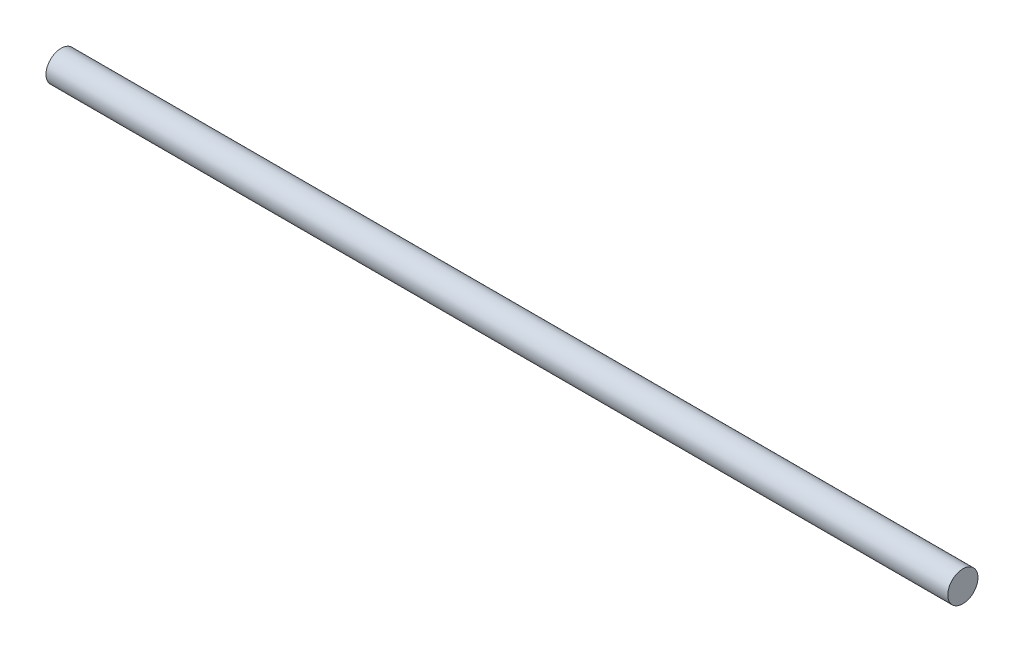
ISO-10303-21;
HEADER;
FILE_DESCRIPTION(('STEP AP214'),'2;1');
FILE_NAME('part.step','',(''),(''),'','','');
FILE_SCHEMA(('AUTOMOTIVE_DESIGN { 1 0 10303 214 1 1 1 1 }'));
ENDSEC;
DATA;
#1=APPLICATION_CONTEXT('core data for automotive mechanical design processes');
#2=APPLICATION_PROTOCOL_DEFINITION('international standard','automotive_design',2000,#1);
#3=PRODUCT_CONTEXT('',#1,'mechanical');
#4=PRODUCT('Part','Part','',(#3));
#5=PRODUCT_RELATED_PRODUCT_CATEGORY('part','',(#4));
#6=PRODUCT_DEFINITION_FORMATION('','',#4);
#7=PRODUCT_DEFINITION_CONTEXT('part definition',#1,'design');
#8=PRODUCT_DEFINITION('design','',#6,#7);
#9=PRODUCT_DEFINITION_SHAPE('','',#8);
#10=(LENGTH_UNIT() NAMED_UNIT(*) SI_UNIT(.MILLI.,.METRE.));
#11=(NAMED_UNIT(*) PLANE_ANGLE_UNIT() SI_UNIT($,.RADIAN.));
#12=(NAMED_UNIT(*) SI_UNIT($,.STERADIAN.) SOLID_ANGLE_UNIT());
#13=UNCERTAINTY_MEASURE_WITH_UNIT(LENGTH_MEASURE(1.E-05),#10,'distance_accuracy_value','');
#14=(GEOMETRIC_REPRESENTATION_CONTEXT(3) GLOBAL_UNCERTAINTY_ASSIGNED_CONTEXT((#13)) GLOBAL_UNIT_ASSIGNED_CONTEXT((#10,
#11,#12)) REPRESENTATION_CONTEXT('',''));
#15=CARTESIAN_POINT('',(0.,0.,0.));
#16=DIRECTION('',(0.,0.,1.));
#17=DIRECTION('',(1.,0.,0.));
#18=AXIS2_PLACEMENT_3D('',#15,#16,#17);
#19=CARTESIAN_POINT('',(70.,0.,0.));
#20=DIRECTION('',(-1.,0.,0.));
#21=DIRECTION('',(0.,0.,1.));
#22=AXIS2_PLACEMENT_3D('',#19,#20,#21);
#23=CYLINDRICAL_SURFACE('',#22,2.35);
#24=CARTESIAN_POINT('',(70.,0.,0.));
#25=DIRECTION('',(1.,0.,0.));
#26=DIRECTION('',(0.,0.,-1.));
#27=AXIS2_PLACEMENT_3D('',#24,#25,#26);
#28=CIRCLE('',#27,2.35);
#29=CARTESIAN_POINT('',(70.,0.,-2.35));
#30=VERTEX_POINT('',#29);
#31=EDGE_CURVE('E10',#30,#30,#28,.T.);
#32=ORIENTED_EDGE('',*,*,#31,.F.);
#33=EDGE_LOOP('',(#32));
#34=FACE_BOUND('',#33,.T.);
#35=CARTESIAN_POINT('',(-70.,0.,0.));
#36=DIRECTION('',(1.,0.,0.));
#37=DIRECTION('',(0.,0.,-1.));
#38=AXIS2_PLACEMENT_3D('',#35,#36,#37);
#39=CIRCLE('',#38,2.35);
#40=CARTESIAN_POINT('',(-70.,0.,-2.35));
#41=VERTEX_POINT('',#40);
#42=EDGE_CURVE('E40',#41,#41,#39,.T.);
#43=ORIENTED_EDGE('',*,*,#42,.T.);
#44=EDGE_LOOP('',(#43));
#45=FACE_BOUND('',#44,.T.);
#46=ADVANCED_FACE('F37',(#34,#45),#23,.T.);
#47=CARTESIAN_POINT('',(70.,0.,0.));
#48=DIRECTION('',(1.,0.,0.));
#49=DIRECTION('',(0.,0.,-1.));
#50=AXIS2_PLACEMENT_3D('',#47,#48,#49);
#51=PLANE('',#50);
#52=ORIENTED_EDGE('',*,*,#31,.T.);
#53=EDGE_LOOP('',(#52));
#54=FACE_BOUND('',#53,.T.);
#55=ADVANCED_FACE('F52',(#54),#51,.T.);
#56=CARTESIAN_POINT('',(-70.,0.,0.));
#57=DIRECTION('',(1.,0.,0.));
#58=DIRECTION('',(0.,0.,-1.));
#59=AXIS2_PLACEMENT_3D('',#56,#57,#58);
#60=PLANE('',#59);
#61=ORIENTED_EDGE('',*,*,#42,.F.);
#62=EDGE_LOOP('',(#61));
#63=FACE_BOUND('',#62,.T.);
#64=ADVANCED_FACE('F50',(#63),#60,.F.);
#65=CLOSED_SHELL('',(#46,#55,#64));
#66=MANIFOLD_SOLID_BREP('B2',#65);
#67=ADVANCED_BREP_SHAPE_REPRESENTATION('',(#18,#66),#14);
#68=SHAPE_DEFINITION_REPRESENTATION(#9,#67);
ENDSEC;
END-ISO-10303-21;
